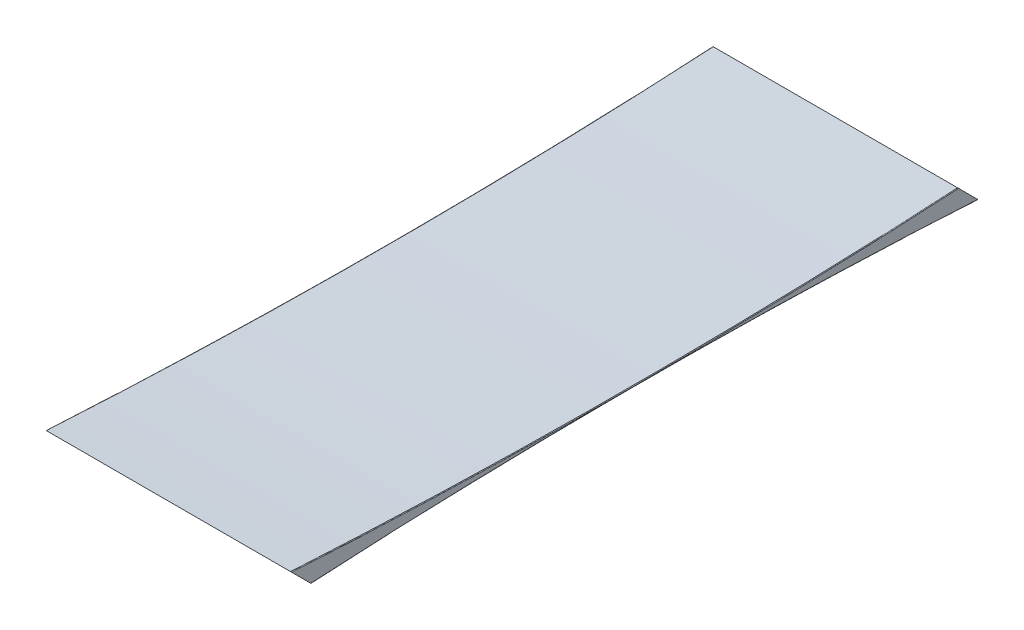
ISO-10303-21;
HEADER;
FILE_DESCRIPTION(('STEP AP214'),'2;1');
FILE_NAME('part.step','',(''),(''),'','','');
FILE_SCHEMA(('AUTOMOTIVE_DESIGN { 1 0 10303 214 1 1 1 1 }'));
ENDSEC;
DATA;
#1=APPLICATION_CONTEXT('core data for automotive mechanical design processes');
#2=APPLICATION_PROTOCOL_DEFINITION('international standard','automotive_design',2000,#1);
#3=PRODUCT_CONTEXT('',#1,'mechanical');
#4=PRODUCT('Part','Part','',(#3));
#5=PRODUCT_RELATED_PRODUCT_CATEGORY('part','',(#4));
#6=PRODUCT_DEFINITION_FORMATION('','',#4);
#7=PRODUCT_DEFINITION_CONTEXT('part definition',#1,'design');
#8=PRODUCT_DEFINITION('design','',#6,#7);
#9=PRODUCT_DEFINITION_SHAPE('','',#8);
#10=(LENGTH_UNIT() NAMED_UNIT(*) SI_UNIT(.MILLI.,.METRE.));
#11=(NAMED_UNIT(*) PLANE_ANGLE_UNIT() SI_UNIT($,.RADIAN.));
#12=(NAMED_UNIT(*) SI_UNIT($,.STERADIAN.) SOLID_ANGLE_UNIT());
#13=UNCERTAINTY_MEASURE_WITH_UNIT(LENGTH_MEASURE(1.E-05),#10,'distance_accuracy_value','');
#14=(GEOMETRIC_REPRESENTATION_CONTEXT(3) GLOBAL_UNCERTAINTY_ASSIGNED_CONTEXT((#13)) GLOBAL_UNIT_ASSIGNED_CONTEXT((#10,
#11,#12)) REPRESENTATION_CONTEXT('',''));
#15=CARTESIAN_POINT('',(0.,0.,0.));
#16=DIRECTION('',(0.,0.,1.));
#17=DIRECTION('',(1.,0.,0.));
#18=AXIS2_PLACEMENT_3D('',#15,#16,#17);
#19=CARTESIAN_POINT('',(-1.,0.087,-2.8));
#20=DIRECTION('',(1.,0.,0.));
#21=DIRECTION('',(0.,0.,-1.));
#22=AXIS2_PLACEMENT_3D('',#19,#20,#21);
#23=PLANE('',#22);
#24=DIRECTION('',(0.,0.707106781186552,0.707106781186543));
#25=VECTOR('',#24,1.);
#26=CARTESIAN_POINT('',(-1.,-0.087,-2.8));
#27=LINE('',#26,#25);
#28=CARTESIAN_POINT('',(-1.,-0.0816798720025339,-2.79467987200253));
#29=VERTEX_POINT('',#28);
#30=CARTESIAN_POINT('',(-1.,0.0728879448080079,-2.64011205519199));
#31=VERTEX_POINT('',#30);
#32=EDGE_CURVE('E222',#29,#31,#27,.T.);
#33=ORIENTED_EDGE('',*,*,#32,.F.);
#34=CARTESIAN_POINT('',(-1.,-47.8508780487805,0.));
#35=DIRECTION('',(1.,0.,0.));
#36=DIRECTION('',(0.,0.,-1.));
#37=AXIS2_PLACEMENT_3D('',#34,#35,#36);
#38=CIRCLE('',#37,47.8508780487805);
#39=CARTESIAN_POINT('',(-1.,0.,0.));
#40=VERTEX_POINT('',#39);
#41=EDGE_CURVE('E11',#29,#40,#38,.T.);
#42=ORIENTED_EDGE('',*,*,#41,.T.);
#43=CARTESIAN_POINT('',(-1.,47.8508780487805,0.));
#44=DIRECTION('',(1.,0.,0.));
#45=DIRECTION('',(0.,0.,-1.));
#46=AXIS2_PLACEMENT_3D('',#43,#44,#45);
#47=CIRCLE('',#46,47.8508780487805);
#48=EDGE_CURVE('E224',#40,#31,#47,.T.);
#49=ORIENTED_EDGE('',*,*,#48,.T.);
#50=EDGE_LOOP('',(#33,#42,#49));
#51=FACE_BOUND('',#50,.T.);
#52=ADVANCED_FACE('F39',(#51),#23,.F.);
#53=CARTESIAN_POINT('',(1.,0.087,-2.8));
#54=DIRECTION('',(-1.,0.,0.));
#55=DIRECTION('',(0.,0.,1.));
#56=AXIS2_PLACEMENT_3D('',#53,#54,#55);
#57=PLANE('',#56);
#58=DIRECTION('',(0.,-0.707106781186546,-0.707106781186549));
#59=VECTOR('',#58,1.);
#60=CARTESIAN_POINT('',(1.,0.087,2.8));
#61=LINE('',#60,#59);
#62=CARTESIAN_POINT('',(1.,0.0816798720025357,2.79467987200254));
#63=VERTEX_POINT('',#62);
#64=CARTESIAN_POINT('',(1.,-0.0728879448080067,2.64011205519199));
#65=VERTEX_POINT('',#64);
#66=EDGE_CURVE('E113',#63,#65,#61,.T.);
#67=ORIENTED_EDGE('',*,*,#66,.T.);
#68=CARTESIAN_POINT('',(1.,-47.8508780487805,0.));
#69=DIRECTION('',(-1.,0.,0.));
#70=DIRECTION('',(0.,0.,1.));
#71=AXIS2_PLACEMENT_3D('',#68,#69,#70);
#72=CIRCLE('',#71,47.8508780487805);
#73=CARTESIAN_POINT('',(1.,0.,0.));
#74=VERTEX_POINT('',#73);
#75=EDGE_CURVE('E115',#65,#74,#72,.T.);
#76=ORIENTED_EDGE('',*,*,#75,.T.);
#77=CARTESIAN_POINT('',(1.,47.8508780487805,0.));
#78=DIRECTION('',(-1.,0.,0.));
#79=DIRECTION('',(0.,0.,1.));
#80=AXIS2_PLACEMENT_3D('',#77,#78,#79);
#81=CIRCLE('',#80,47.8508780487805);
#82=EDGE_CURVE('E110',#74,#63,#81,.T.);
#83=ORIENTED_EDGE('',*,*,#82,.T.);
#84=EDGE_LOOP('',(#67,#76,#83));
#85=FACE_BOUND('',#84,.T.);
#86=ADVANCED_FACE('F112',(#85),#57,.F.);
#87=CARTESIAN_POINT('',(1.,47.8508780487805,0.));
#88=DIRECTION('',(-1.,0.,0.));
#89=DIRECTION('',(0.,0.,1.));
#90=AXIS2_PLACEMENT_3D('',#87,#88,#89);
#91=CIRCLE('',#90,47.8508780487805);
#92=CARTESIAN_POINT('',(1.,0.0728879448080079,-2.64011205519199));
#93=VERTEX_POINT('',#92);
#94=EDGE_CURVE('E121',#93,#74,#91,.T.);
#95=ORIENTED_EDGE('',*,*,#94,.T.);
#96=CARTESIAN_POINT('',(1.,-47.8508780487805,0.));
#97=DIRECTION('',(-1.,0.,0.));
#98=DIRECTION('',(0.,0.,1.));
#99=AXIS2_PLACEMENT_3D('',#96,#97,#98);
#100=CIRCLE('',#99,47.8508780487805);
#101=CARTESIAN_POINT('',(1.,-0.0816798720025339,-2.79467987200253));
#102=VERTEX_POINT('',#101);
#103=EDGE_CURVE('E254',#74,#102,#100,.T.);
#104=ORIENTED_EDGE('',*,*,#103,.T.);
#105=DIRECTION('',(0.,0.707106781186552,0.707106781186543));
#106=VECTOR('',#105,1.);
#107=CARTESIAN_POINT('',(1.,-0.087,-2.8));
#108=LINE('',#107,#106);
#109=EDGE_CURVE('E226',#102,#93,#108,.T.);
#110=ORIENTED_EDGE('',*,*,#109,.T.);
#111=EDGE_LOOP('',(#95,#104,#110));
#112=FACE_BOUND('',#111,.T.);
#113=ADVANCED_FACE('F199',(#112),#57,.F.);
#114=CARTESIAN_POINT('',(-1.,47.8508780487805,0.));
#115=DIRECTION('',(1.,0.,0.));
#116=DIRECTION('',(0.,0.,-1.));
#117=AXIS2_PLACEMENT_3D('',#114,#115,#116);
#118=CIRCLE('',#117,47.8508780487805);
#119=CARTESIAN_POINT('',(-1.,0.0816798720025357,2.79467987200254));
#120=VERTEX_POINT('',#119);
#121=EDGE_CURVE('E233',#120,#40,#118,.T.);
#122=ORIENTED_EDGE('',*,*,#121,.T.);
#123=CARTESIAN_POINT('',(-1.,-47.8508780487805,0.));
#124=DIRECTION('',(1.,0.,0.));
#125=DIRECTION('',(0.,0.,-1.));
#126=AXIS2_PLACEMENT_3D('',#123,#124,#125);
#127=CIRCLE('',#126,47.8508780487805);
#128=CARTESIAN_POINT('',(-1.,-0.0728879448080067,2.64011205519199));
#129=VERTEX_POINT('',#128);
#130=EDGE_CURVE('E48',#40,#129,#127,.T.);
#131=ORIENTED_EDGE('',*,*,#130,.T.);
#132=DIRECTION('',(0.,-0.707106781186546,-0.707106781186549));
#133=VECTOR('',#132,1.);
#134=CARTESIAN_POINT('',(-1.,0.087,2.8));
#135=LINE('',#134,#133);
#136=EDGE_CURVE('E133',#120,#129,#135,.T.);
#137=ORIENTED_EDGE('',*,*,#136,.F.);
#138=EDGE_LOOP('',(#122,#131,#137));
#139=FACE_BOUND('',#138,.T.);
#140=ADVANCED_FACE('F203',(#139),#23,.F.);
#141=CARTESIAN_POINT('',(1.,-47.8508780487805,0.));
#142=DIRECTION('',(-1.,0.,0.));
#143=DIRECTION('',(0.,0.,1.));
#144=AXIS2_PLACEMENT_3D('',#141,#142,#143);
#145=CYLINDRICAL_SURFACE('',#144,47.8458780487805);
#146=DIRECTION('',(-1.,0.,0.));
#147=VECTOR('',#146,1.);
#148=CARTESIAN_POINT('',(-1.,-0.087,-2.8));
#149=LINE('',#148,#147);
#150=CARTESIAN_POINT('',(0.995,-0.087,-2.8));
#151=VERTEX_POINT('',#150);
#152=CARTESIAN_POINT('',(-0.995000000000001,-0.087,-2.8));
#153=VERTEX_POINT('',#152);
#154=EDGE_CURVE('E245',#151,#153,#149,.T.);
#155=ORIENTED_EDGE('',*,*,#154,.F.);
#156=CARTESIAN_POINT('',(0.995,-47.8508780487805,0.));
#157=DIRECTION('',(-1.,0.,0.));
#158=DIRECTION('',(0.,0.,1.));
#159=AXIS2_PLACEMENT_3D('',#156,#157,#158);
#160=CIRCLE('',#159,47.8458780487805);
#161=CARTESIAN_POINT('',(0.995,-0.0776335500721238,2.63536644992788));
#162=VERTEX_POINT('',#161);
#163=EDGE_CURVE('E178',#151,#162,#160,.F.);
#164=ORIENTED_EDGE('',*,*,#163,.T.);
#165=DIRECTION('',(-1.,0.,0.));
#166=VECTOR('',#165,1.);
#167=CARTESIAN_POINT('',(1.,-0.0776335500721238,2.63536644992788));
#168=LINE('',#167,#166);
#169=CARTESIAN_POINT('',(-0.995000000000001,-0.0776335500721238,2.63536644992788));
#170=VERTEX_POINT('',#169);
#171=EDGE_CURVE('E132',#162,#170,#168,.T.);
#172=ORIENTED_EDGE('',*,*,#171,.T.);
#173=CARTESIAN_POINT('',(-0.995000000000001,-47.8508780487805,0.));
#174=DIRECTION('',(1.,0.,0.));
#175=DIRECTION('',(0.,0.,-1.));
#176=AXIS2_PLACEMENT_3D('',#173,#174,#175);
#177=CIRCLE('',#176,47.8458780487805);
#178=EDGE_CURVE('E180',#170,#153,#177,.F.);
#179=ORIENTED_EDGE('',*,*,#178,.T.);
#180=EDGE_LOOP('',(#155,#164,#172,#179));
#181=FACE_BOUND('',#180,.T.);
#182=ADVANCED_FACE('F207',(#181),#145,.F.);
#183=CARTESIAN_POINT('',(1.,47.8508780487805,0.));
#184=DIRECTION('',(-1.,0.,0.));
#185=DIRECTION('',(0.,0.,1.));
#186=AXIS2_PLACEMENT_3D('',#183,#184,#185);
#187=CYLINDRICAL_SURFACE('',#186,47.8458780487805);
#188=DIRECTION('',(1.,0.,0.));
#189=VECTOR('',#188,1.);
#190=CARTESIAN_POINT('',(-1.,0.087,2.8));
#191=LINE('',#190,#189);
#192=CARTESIAN_POINT('',(-0.995000000000001,0.087,2.8));
#193=VERTEX_POINT('',#192);
#194=CARTESIAN_POINT('',(0.995,0.087,2.8));
#195=VERTEX_POINT('',#194);
#196=EDGE_CURVE('E243',#193,#195,#191,.T.);
#197=ORIENTED_EDGE('',*,*,#196,.T.);
#198=CARTESIAN_POINT('',(0.995,47.8508780487805,0.));
#199=DIRECTION('',(-1.,0.,0.));
#200=DIRECTION('',(0.,0.,1.));
#201=AXIS2_PLACEMENT_3D('',#198,#199,#200);
#202=CIRCLE('',#201,47.8458780487805);
#203=CARTESIAN_POINT('',(0.995,0.0776335500721238,-2.63536644992787));
#204=VERTEX_POINT('',#203);
#205=EDGE_CURVE('E138',#195,#204,#202,.F.);
#206=ORIENTED_EDGE('',*,*,#205,.T.);
#207=DIRECTION('',(-1.,0.,0.));
#208=VECTOR('',#207,1.);
#209=CARTESIAN_POINT('',(1.,0.0776335500721238,-2.63536644992787));
#210=LINE('',#209,#208);
#211=CARTESIAN_POINT('',(-0.995000000000001,0.0776335500721238,-2.63536644992787));
#212=VERTEX_POINT('',#211);
#213=EDGE_CURVE('E122',#204,#212,#210,.T.);
#214=ORIENTED_EDGE('',*,*,#213,.T.);
#215=CARTESIAN_POINT('',(-0.995000000000001,47.8508780487805,0.));
#216=DIRECTION('',(1.,0.,0.));
#217=DIRECTION('',(0.,0.,-1.));
#218=AXIS2_PLACEMENT_3D('',#215,#216,#217);
#219=CIRCLE('',#218,47.8458780487805);
#220=EDGE_CURVE('E141',#212,#193,#219,.F.);
#221=ORIENTED_EDGE('',*,*,#220,.T.);
#222=EDGE_LOOP('',(#197,#206,#214,#221));
#223=FACE_BOUND('',#222,.T.);
#224=ADVANCED_FACE('F209',(#223),#187,.F.);
#225=CARTESIAN_POINT('',(1.,-0.087,-2.8));
#226=DIRECTION('',(0.,-0.707106781186543,0.707106781186552));
#227=DIRECTION('',(0.,-0.707106781186552,-0.707106781186543));
#228=AXIS2_PLACEMENT_3D('',#225,#226,#227);
#229=PLANE('',#228);
#230=ORIENTED_EDGE('',*,*,#109,.F.);
#231=CARTESIAN_POINT('',(1.,-0.0816798720025338,-2.79467987200253));
#232=CARTESIAN_POINT('',(0.999998683792411,-0.0821121717058165,-2.79511217170582));
#233=CARTESIAN_POINT('',(0.999950170348066,-0.0825466146464124,-2.79554661464641));
#234=CARTESIAN_POINT('',(0.999747872332375,-0.0834080218772378,-2.79640802187724));
#235=CARTESIAN_POINT('',(0.999592864285455,-0.0838348394598447,-2.79683483945984));
#236=CARTESIAN_POINT('',(0.999247995260036,-0.0845005570585022,-2.7975005570585));
#237=CARTESIAN_POINT('',(0.999094250409052,-0.0847487933637279,-2.79774879336373));
#238=CARTESIAN_POINT('',(0.998737801105745,-0.0852265069057193,-2.79822650690572));
#239=CARTESIAN_POINT('',(0.99853527013512,-0.0854560468398723,-2.79845604683987));
#240=CARTESIAN_POINT('',(0.99813680900477,-0.0858296573216617,-2.79882965732166));
#241=CARTESIAN_POINT('',(0.997953248429835,-0.0859802949824659,-2.79898029498247));
#242=CARTESIAN_POINT('',(0.997555179474348,-0.0862598056698357,-2.79925980566984));
#243=CARTESIAN_POINT('',(0.997340704734536,-0.0863887020285581,-2.79938870202856));
#244=CARTESIAN_POINT('',(0.996934743564047,-0.0865899125991077,-2.79958991259911));
#245=CARTESIAN_POINT('',(0.996749422341879,-0.086668418022439,-2.79966841802244));
#246=CARTESIAN_POINT('',(0.996363333865869,-0.0868029374896735,-2.79980293748967));
#247=CARTESIAN_POINT('',(0.996162606867747,-0.086859007922175,-2.79985900792218));
#248=CARTESIAN_POINT('',(0.995801626057288,-0.0869338490835032,-2.7999338490835));
#249=CARTESIAN_POINT('',(0.99564377031734,-0.0869584358189863,-2.79995843581899));
#250=CARTESIAN_POINT('',(0.995324024054903,-0.0869916141569341,-2.79999161415693));
#251=CARTESIAN_POINT('',(0.995162118456007,-0.0870001325589239,-2.80000013255892));
#252=CARTESIAN_POINT('',(0.99500000000017,-0.0870000000004094,-2.80000000000041));
#253=B_SPLINE_CURVE_WITH_KNOTS('',3,(#231,#232,#233,#234,#235,#236,#237,#238,#239,#240,#241,
#242,#243,#244,#245,#246,#247,#248,#249,#250,#251,#252),.UNSPECIFIED.,.F.,.F.,(4,2,2,2,2,2,2,2,
2,2,4),(0.,0.00183749282639248,0.00369645687012474,0.0048430809514714,0.00598568635516742,
0.00682668264974607,0.00766677058769647,0.00831245724891956,0.00895651067610101,
0.00943986385642203,0.00992541371919267),.UNSPECIFIED.);
#254=EDGE_CURVE('E183',#102,#151,#253,.T.);
#255=ORIENTED_EDGE('',*,*,#254,.T.);
#256=ORIENTED_EDGE('',*,*,#154,.T.);
#257=CARTESIAN_POINT('',(-0.995000000000001,-0.087,-2.8));
#258=CARTESIAN_POINT('',(-0.995216901893383,-0.0870004101722005,-2.8000004101722));
#259=CARTESIAN_POINT('',(-0.995433140295378,-0.0869850101276896,-2.79998501012769));
#260=CARTESIAN_POINT('',(-0.995855753114274,-0.0869262348870719,-2.79992623488707));
#261=CARTESIAN_POINT('',(-0.99606220405846,-0.0868831384957062,-2.79988313849571));
#262=CARTESIAN_POINT('',(-0.996460575861353,-0.0867726781872132,-2.79977267818721));
#263=CARTESIAN_POINT('',(-0.996652543931191,-0.0867053976436001,-2.7997053976436));
#264=CARTESIAN_POINT('',(-0.997020137676347,-0.08655096344999,-2.79955096344999));
#265=CARTESIAN_POINT('',(-0.997195719004697,-0.0864637579556234,-2.79946375795562));
#266=CARTESIAN_POINT('',(-0.997606390059985,-0.0862295140165084,-2.79922951401651));
#267=CARTESIAN_POINT('',(-0.997831224624072,-0.0860735013741543,-2.79907350137415));
#268=CARTESIAN_POINT('',(-0.998243133097384,-0.085738415200935,-2.79873841520094));
#269=CARTESIAN_POINT('',(-0.998430132746487,-0.0855592974271281,-2.79855929742713));
#270=CARTESIAN_POINT('',(-0.998847966936125,-0.0850981666668505,-2.79809816666685));
#271=CARTESIAN_POINT('',(-0.99905868611793,-0.0848070687889248,-2.79780706878892));
#272=CARTESIAN_POINT('',(-0.999413527209268,-0.0842050307371218,-2.79720503073712));
#273=CARTESIAN_POINT('',(-0.999557463486291,-0.0838940379570791,-2.79689403795708));
#274=CARTESIAN_POINT('',(-0.999782664783342,-0.0832666673563759,-2.79626666735638));
#275=CARTESIAN_POINT('',(-0.999864940884833,-0.0829504674585192,-2.79595046745852));
#276=CARTESIAN_POINT('',(-0.999973171211622,-0.0823160001205753,-2.79531600012058));
#277=CARTESIAN_POINT('',(-0.999999605018077,-0.0819977740251477,-2.79499777402515));
#278=CARTESIAN_POINT('',(-1.00000000000021,-0.0816798720025721,-2.79467987200257));
#279=B_SPLINE_CURVE_WITH_KNOTS('',3,(#257,#258,#259,#260,#261,#262,#263,#264,#265,#266,#267,
#268,#269,#270,#271,#272,#273,#274,#275,#276,#277,#278),.UNSPECIFIED.,.F.,.F.,(4,2,2,2,2,2,2,2,
2,2,4),(0.,0.000648562964042904,0.0012906973256875,0.00193063886871312,0.00257226488327262,
0.00351200879358195,0.00445357965675983,0.0058334481424035,0.00721712952191226,
0.0085775930704448,0.00992632446580622),.UNSPECIFIED.);
#280=EDGE_CURVE('E231',#153,#29,#279,.T.);
#281=ORIENTED_EDGE('',*,*,#280,.T.);
#282=ORIENTED_EDGE('',*,*,#32,.T.);
#283=CARTESIAN_POINT('',(-1.,0.0728879448080102,-2.640112055192));
#284=CARTESIAN_POINT('',(-0.999999733058547,0.0731853477140063,-2.639814652286));
#285=CARTESIAN_POINT('',(-0.999970500026461,0.0734831348981257,-2.63951686510188));
#286=CARTESIAN_POINT('',(-0.999851654941646,0.0740747401933507,-2.63892525980665));
#287=CARTESIAN_POINT('',(-0.999761612835676,0.0743685147242253,-2.63863148527578));
#288=CARTESIAN_POINT('',(-0.99952762789137,0.0749216733735903,-2.63807832662641));
#289=CARTESIAN_POINT('',(-0.999388162762115,0.0751819942151301,-2.63781800578487));
#290=CARTESIAN_POINT('',(-0.999052506486514,0.0756833429174989,-2.6373166570825));
#291=CARTESIAN_POINT('',(-0.998856462248008,0.0759244187046625,-2.63707558129534));
#292=CARTESIAN_POINT('',(-0.998460898871596,0.0763209415694909,-2.63667905843051));
#293=CARTESIAN_POINT('',(-0.998274269560641,0.076482807353918,-2.63651719264608));
#294=CARTESIAN_POINT('',(-0.997866893920721,0.0767836266447907,-2.63621637335521));
#295=CARTESIAN_POINT('',(-0.997646182786725,0.0769226034852074,-2.63607739651479));
#296=CARTESIAN_POINT('',(-0.997217573066351,0.0771463291589208,-2.63585367084108));
#297=CARTESIAN_POINT('',(-0.997015210840402,0.0772363643106262,-2.63576363568938));
#298=CARTESIAN_POINT('',(-0.99659242689804,0.0773915464479309,-2.63560845355207));
#299=CARTESIAN_POINT('',(-0.996372043878006,0.0774567451448126,-2.63554325485519));
#300=CARTESIAN_POINT('',(-0.995960657051716,0.077548595505437,-2.63545140449457));
#301=CARTESIAN_POINT('',(-0.995771847595812,0.0775801706274319,-2.63541982937257));
#302=CARTESIAN_POINT('',(-0.995388793614696,0.0776227828702938,-2.63537721712971));
#303=CARTESIAN_POINT('',(-0.995194528126399,0.0776337250904129,-2.63536627490959));
#304=CARTESIAN_POINT('',(-0.995000000000521,0.0776335500732904,-2.63536644992671));
#305=B_SPLINE_CURVE_WITH_KNOTS('',3,(#283,#284,#285,#286,#287,#288,#289,#290,#291,#292,#293,
#294,#295,#296,#297,#298,#299,#300,#301,#302,#303,#304),.UNSPECIFIED.,.F.,.F.,(4,2,2,2,2,2,2,2,
2,2,4),(0.,0.001261686936575,0.00253239151983525,0.00370913987332889,0.00488285986963996,
0.00576584075079779,0.00664791583567737,0.00736235851857031,0.00807530544261987,
0.00865517775106186,0.00923771072943985),.UNSPECIFIED.);
#306=EDGE_CURVE('E237',#31,#212,#305,.T.);
#307=ORIENTED_EDGE('',*,*,#306,.T.);
#308=ORIENTED_EDGE('',*,*,#213,.F.);
#309=CARTESIAN_POINT('',(0.995,0.0776335500721169,-2.63536644992787));
#310=CARTESIAN_POINT('',(0.995231390024723,0.077633902503595,-2.6353660974964));
#311=CARTESIAN_POINT('',(0.995462283299717,0.077618329283271,-2.63538167071673));
#312=CARTESIAN_POINT('',(0.995914714372969,0.077558354881895,-2.63544164511811));
#313=CARTESIAN_POINT('',(0.996136310025915,0.0775141741379011,-2.6354858258621));
#314=CARTESIAN_POINT('',(0.996565026090545,0.0774000555090798,-2.63559994449092));
#315=CARTESIAN_POINT('',(0.996772177924585,0.0773301757531332,-2.63566982424687));
#316=CARTESIAN_POINT('',(0.997169034294186,0.0771686616823024,-2.6358313383177));
#317=CARTESIAN_POINT('',(0.997358703567557,0.0770769846797331,-2.63592301532027));
#318=CARTESIAN_POINT('',(0.997782413187157,0.0768399956551473,-2.63616000434485));
#319=CARTESIAN_POINT('',(0.998008106739274,0.0766872219068775,-2.63631277809312));
#320=CARTESIAN_POINT('',(0.998421496928208,0.0763579093933628,-2.63664209060664));
#321=CARTESIAN_POINT('',(0.998609131562479,0.0761813326167167,-2.63681866738329));
#322=CARTESIAN_POINT('',(0.999001205742222,0.0757520293960761,-2.63724797060393));
#323=CARTESIAN_POINT('',(0.999191831804915,0.0754930084130108,-2.63750699158699));
#324=CARTESIAN_POINT('',(0.999511682114065,0.0749565497915819,-2.63804345020842));
#325=CARTESIAN_POINT('',(0.99964079426304,0.0746790795731638,-2.63832092042684));
#326=CARTESIAN_POINT('',(0.999827924622525,0.0741494264203025,-2.6388505735797));
#327=CARTESIAN_POINT('',(0.999892822710276,0.0738984300166614,-2.63910156998334));
#328=CARTESIAN_POINT('',(0.999978651711754,0.0733942194740792,-2.63960578052592));
#329=CARTESIAN_POINT('',(0.9999998456152,0.0731410278621633,-2.63985897213784));
#330=CARTESIAN_POINT('',(1.00000000000015,0.0728879448080341,-2.64011205519197));
#331=B_SPLINE_CURVE_WITH_KNOTS('',3,(#309,#310,#311,#312,#313,#314,#315,#316,#317,#318,#319,
#320,#321,#322,#323,#324,#325,#326,#327,#328,#329,#330),.UNSPECIFIED.,.F.,.F.,(4,2,2,2,2,2,2,2,
2,2,4),(0.,0.000692336828693087,0.00137940129629631,0.00206492114872294,0.00275179474346796,
0.00368398860277266,0.00461768913153838,0.00584996823996211,0.00708448443548483,
0.00816435146879968,0.00923770121723926),.UNSPECIFIED.);
#332=EDGE_CURVE('E189',#204,#93,#331,.T.);
#333=ORIENTED_EDGE('',*,*,#332,.T.);
#334=EDGE_LOOP('',(#230,#255,#256,#281,#282,#307,#308,#333));
#335=FACE_BOUND('',#334,.T.);
#336=ADVANCED_FACE('F167',(#335),#229,.F.);
#337=CARTESIAN_POINT('',(1.,0.087,2.8));
#338=DIRECTION('',(0.,0.707106781186549,-0.707106781186546));
#339=DIRECTION('',(0.,0.707106781186546,0.707106781186549));
#340=AXIS2_PLACEMENT_3D('',#337,#338,#339);
#341=PLANE('',#340);
#342=ORIENTED_EDGE('',*,*,#171,.F.);
#343=CARTESIAN_POINT('',(0.995,-0.0776335500721169,2.63536644992788));
#344=CARTESIAN_POINT('',(0.995231390024724,-0.0776339025035952,2.6353660974964));
#345=CARTESIAN_POINT('',(0.995462283299718,-0.0776183292832712,2.63538167071673));
#346=CARTESIAN_POINT('',(0.99591471437297,-0.0775583548818948,2.63544164511811));
#347=CARTESIAN_POINT('',(0.996136310025916,-0.0775141741379008,2.6354858258621));
#348=CARTESIAN_POINT('',(0.996565026090545,-0.077400055509079,2.63559994449092));
#349=CARTESIAN_POINT('',(0.996772177924585,-0.077330175753132,2.63566982424687));
#350=CARTESIAN_POINT('',(0.997169034294185,-0.0771686616823008,2.6358313383177));
#351=CARTESIAN_POINT('',(0.997358703567556,-0.0770769846797313,2.63592301532027));
#352=CARTESIAN_POINT('',(0.997782413187157,-0.0768399956551455,2.63616000434485));
#353=CARTESIAN_POINT('',(0.998008106739273,-0.0766872219068757,2.63631277809312));
#354=CARTESIAN_POINT('',(0.998421496928212,-0.0763579093933633,2.63664209060664));
#355=CARTESIAN_POINT('',(0.998609131562487,-0.0761813326167193,2.63681866738328));
#356=CARTESIAN_POINT('',(0.999001205742231,-0.0757520293960795,2.63724797060392));
#357=CARTESIAN_POINT('',(0.999191831804919,-0.0754930084130116,2.63750699158699));
#358=CARTESIAN_POINT('',(0.999511682114064,-0.0749565497915795,2.63804345020842));
#359=CARTESIAN_POINT('',(0.999640794263039,-0.0746790795731611,2.63832092042684));
#360=CARTESIAN_POINT('',(0.999827924622526,-0.0741494264202992,2.6388505735797));
#361=CARTESIAN_POINT('',(0.999892822710278,-0.073898430016658,2.63910156998334));
#362=CARTESIAN_POINT('',(0.999978651711757,-0.0733942194740764,2.63960578052592));
#363=CARTESIAN_POINT('',(0.999999845615202,-0.0731410278621613,2.63985897213784));
#364=CARTESIAN_POINT('',(1.00000000000015,-0.0728879448080329,2.64011205519197));
#365=B_SPLINE_CURVE_WITH_KNOTS('',3,(#343,#344,#345,#346,#347,#348,#349,#350,#351,#352,#353,
#354,#355,#356,#357,#358,#359,#360,#361,#362,#363,#364),.UNSPECIFIED.,.F.,.F.,(4,2,2,2,2,2,2,2,
2,2,4),(0.,0.000692336828694219,0.00137940129629595,0.00206492114872238,0.00275179474346773,
0.00368398860277326,0.00461768913153848,0.00584996823996364,0.00708448443548973,
0.00816435146880505,0.00923770121724134),.UNSPECIFIED.);
#366=EDGE_CURVE('E131',#162,#65,#365,.T.);
#367=ORIENTED_EDGE('',*,*,#366,.T.);
#368=ORIENTED_EDGE('',*,*,#66,.F.);
#369=CARTESIAN_POINT('',(1.,0.0816798720025373,2.79467987200253));
#370=CARTESIAN_POINT('',(0.999998683792411,0.0821121717058192,2.79511217170582));
#371=CARTESIAN_POINT('',(0.999950170348067,0.0825466146464153,2.79554661464642));
#372=CARTESIAN_POINT('',(0.999747872332375,0.0834080218772405,2.79640802187724));
#373=CARTESIAN_POINT('',(0.999592864285455,0.0838348394598471,2.79683483945985));
#374=CARTESIAN_POINT('',(0.999247995260036,0.0845005570585035,2.7975005570585));
#375=CARTESIAN_POINT('',(0.999094250409052,0.0847487933637286,2.79774879336373));
#376=CARTESIAN_POINT('',(0.998737801105745,0.0852265069057194,2.79822650690572));
#377=CARTESIAN_POINT('',(0.99853527013512,0.0854560468398722,2.79845604683987));
#378=CARTESIAN_POINT('',(0.99813680900477,0.0858296573216622,2.79882965732166));
#379=CARTESIAN_POINT('',(0.997953248429835,0.0859802949824668,2.79898029498247));
#380=CARTESIAN_POINT('',(0.997555179474348,0.086259805669837,2.79925980566984));
#381=CARTESIAN_POINT('',(0.997340704734537,0.0863887020285592,2.79938870202856));
#382=CARTESIAN_POINT('',(0.996934743564046,0.0865899125991078,2.79958991259911));
#383=CARTESIAN_POINT('',(0.996749422341877,0.0866684180224384,2.79966841802244));
#384=CARTESIAN_POINT('',(0.996363333865865,0.0868029374896702,2.79980293748967));
#385=CARTESIAN_POINT('',(0.996162606867742,0.0868590079221699,2.79985900792217));
#386=CARTESIAN_POINT('',(0.995801626057282,0.0869338490834971,2.7999338490835));
#387=CARTESIAN_POINT('',(0.995643770317335,0.0869584358189805,2.79995843581898));
#388=CARTESIAN_POINT('',(0.9953240240549,0.0869916141569303,2.79999161415693));
#389=CARTESIAN_POINT('',(0.995162118456005,0.0870001325589218,2.80000013255892));
#390=CARTESIAN_POINT('',(0.995000000000169,0.0870000000004095,2.80000000000041));
#391=B_SPLINE_CURVE_WITH_KNOTS('',3,(#369,#370,#371,#372,#373,#374,#375,#376,#377,#378,#379,
#380,#381,#382,#383,#384,#385,#386,#387,#388,#389,#390),.UNSPECIFIED.,.F.,.F.,(4,2,2,2,2,2,2,2,
2,2,4),(0.,0.00183749282639481,0.00369645687012487,0.00484308095146969,0.00598568635516536,
0.00682668264974519,0.00766677058769518,0.00831245724891865,0.00895651067610159,
0.00943986385642125,0.00992541371918825),.UNSPECIFIED.);
#392=EDGE_CURVE('E128',#63,#195,#391,.T.);
#393=ORIENTED_EDGE('',*,*,#392,.T.);
#394=ORIENTED_EDGE('',*,*,#196,.F.);
#395=CARTESIAN_POINT('',(-0.995000000000001,0.087,2.8));
#396=CARTESIAN_POINT('',(-0.995216901893383,0.0870004101722005,2.8000004101722));
#397=CARTESIAN_POINT('',(-0.995433140295378,0.0869850101276896,2.79998501012769));
#398=CARTESIAN_POINT('',(-0.995855753114274,0.0869262348870719,2.79992623488707));
#399=CARTESIAN_POINT('',(-0.99606220405846,0.0868831384957061,2.79988313849571));
#400=CARTESIAN_POINT('',(-0.996460575861353,0.0867726781872132,2.79977267818721));
#401=CARTESIAN_POINT('',(-0.996652543931191,0.0867053976436001,2.7997053976436));
#402=CARTESIAN_POINT('',(-0.997020137676347,0.08655096344999,2.79955096344999));
#403=CARTESIAN_POINT('',(-0.997195719004697,0.0864637579556234,2.79946375795562));
#404=CARTESIAN_POINT('',(-0.997606390059985,0.0862295140165084,2.79922951401651));
#405=CARTESIAN_POINT('',(-0.997831224624072,0.0860735013741543,2.79907350137415));
#406=CARTESIAN_POINT('',(-0.998243133097384,0.0857384152009349,2.79873841520093));
#407=CARTESIAN_POINT('',(-0.998430132746487,0.085559297427128,2.79855929742713));
#408=CARTESIAN_POINT('',(-0.998847966936125,0.0850981666668505,2.79809816666685));
#409=CARTESIAN_POINT('',(-0.99905868611793,0.084807068788925,2.79780706878892));
#410=CARTESIAN_POINT('',(-0.999413527209268,0.084205030737122,2.79720503073712));
#411=CARTESIAN_POINT('',(-0.999557463486291,0.0838940379570792,2.79689403795708));
#412=CARTESIAN_POINT('',(-0.999782664783342,0.0832666673563762,2.79626666735638));
#413=CARTESIAN_POINT('',(-0.999864940884833,0.0829504674585198,2.79595046745852));
#414=CARTESIAN_POINT('',(-0.999973171211622,0.0823160001205765,2.79531600012058));
#415=CARTESIAN_POINT('',(-0.999999605018077,0.0819977740251492,2.79499777402515));
#416=CARTESIAN_POINT('',(-1.00000000000021,0.0816798720025738,2.79467987200257));
#417=B_SPLINE_CURVE_WITH_KNOTS('',3,(#395,#396,#397,#398,#399,#400,#401,#402,#403,#404,#405,
#406,#407,#408,#409,#410,#411,#412,#413,#414,#415,#416),.UNSPECIFIED.,.F.,.F.,(4,2,2,2,2,2,2,2,
2,2,4),(0.,0.000648562964042904,0.0012906973256875,0.00193063886871312,0.00257226488327262,
0.00351200879358237,0.0044535796567598,0.00583344814240325,0.0072171295219122,
0.00857759307044348,0.00992632446580373),.UNSPECIFIED.);
#418=EDGE_CURVE('E143',#193,#120,#417,.T.);
#419=ORIENTED_EDGE('',*,*,#418,.T.);
#420=ORIENTED_EDGE('',*,*,#136,.T.);
#421=CARTESIAN_POINT('',(-1.,-0.0728879448080102,2.640112055192));
#422=CARTESIAN_POINT('',(-0.999999733058547,-0.0731853477140057,2.639814652286));
#423=CARTESIAN_POINT('',(-0.999970500026461,-0.0734831348981247,2.63951686510188));
#424=CARTESIAN_POINT('',(-0.999851654941646,-0.0740747401933494,2.63892525980665));
#425=CARTESIAN_POINT('',(-0.999761612835676,-0.074368514724224,2.63863148527578));
#426=CARTESIAN_POINT('',(-0.99952762789137,-0.0749216733735893,2.63807832662641));
#427=CARTESIAN_POINT('',(-0.999388162762115,-0.0751819942151292,2.63781800578487));
#428=CARTESIAN_POINT('',(-0.999052506486514,-0.0756833429174977,2.6373166570825));
#429=CARTESIAN_POINT('',(-0.998856462248007,-0.0759244187046609,2.63707558129534));
#430=CARTESIAN_POINT('',(-0.998460898871597,-0.0763209415694907,2.63667905843051));
#431=CARTESIAN_POINT('',(-0.998274269560642,-0.0764828073539191,2.63651719264608));
#432=CARTESIAN_POINT('',(-0.997866893920719,-0.0767836266447901,2.63621637335521));
#433=CARTESIAN_POINT('',(-0.997646182786719,-0.0769226034852038,2.6360773965148));
#434=CARTESIAN_POINT('',(-0.99721757306635,-0.0771463291589242,2.63585367084108));
#435=CARTESIAN_POINT('',(-0.997015210840408,-0.0772363643106371,2.63576363568936));
#436=CARTESIAN_POINT('',(-0.996592426898047,-0.0773915464479412,2.63560845355206));
#437=CARTESIAN_POINT('',(-0.996372043878007,-0.0774567451448146,2.63554325485518));
#438=CARTESIAN_POINT('',(-0.995960657051714,-0.0775485955054336,2.63545140449457));
#439=CARTESIAN_POINT('',(-0.995771847595811,-0.0775801706274295,2.63541982937257));
#440=CARTESIAN_POINT('',(-0.995388793614697,-0.0776227828702936,2.63537721712971));
#441=CARTESIAN_POINT('',(-0.995194528126402,-0.0776337250904138,2.63536627490959));
#442=CARTESIAN_POINT('',(-0.995000000000523,-0.0776335500732887,2.63536644992671));
#443=B_SPLINE_CURVE_WITH_KNOTS('',3,(#421,#422,#423,#424,#425,#426,#427,#428,#429,#430,#431,
#432,#433,#434,#435,#436,#437,#438,#439,#440,#441,#442),.UNSPECIFIED.,.F.,.F.,(4,2,2,2,2,2,2,2,
2,2,4),(0.,0.00126168693657476,0.00253239151983541,0.00370913987332907,0.0048828598696401,
0.00576584075080005,0.00664791583568156,0.00736235851857452,0.00807530544262398,
0.00865517775106499,0.00923771072944165),.UNSPECIFIED.);
#444=EDGE_CURVE('E139',#129,#170,#443,.T.);
#445=ORIENTED_EDGE('',*,*,#444,.T.);
#446=EDGE_LOOP('',(#342,#367,#368,#393,#394,#419,#420,#445));
#447=FACE_BOUND('',#446,.T.);
#448=ADVANCED_FACE('F126',(#447),#341,.F.);
#449=CARTESIAN_POINT('',(0.995,-47.8508780487805,0.));
#450=DIRECTION('',(-1.,0.,0.));
#451=DIRECTION('',(0.,0.,1.));
#452=AXIS2_PLACEMENT_3D('',#449,#450,#451);
#453=TOROIDAL_SURFACE('',#452,47.8508780487805,0.005);
#454=ORIENTED_EDGE('',*,*,#366,.F.);
#455=ORIENTED_EDGE('',*,*,#163,.F.);
#456=ORIENTED_EDGE('',*,*,#254,.F.);
#457=ORIENTED_EDGE('',*,*,#103,.F.);
#458=ORIENTED_EDGE('',*,*,#75,.F.);
#459=EDGE_LOOP('',(#454,#455,#456,#457,#458));
#460=FACE_BOUND('',#459,.T.);
#461=ADVANCED_FACE('F166',(#460),#453,.T.);
#462=CARTESIAN_POINT('',(0.995,47.8508780487805,0.));
#463=DIRECTION('',(-1.,0.,0.));
#464=DIRECTION('',(0.,0.,1.));
#465=AXIS2_PLACEMENT_3D('',#462,#463,#464);
#466=TOROIDAL_SURFACE('',#465,47.8508780487805,0.005);
#467=ORIENTED_EDGE('',*,*,#332,.F.);
#468=ORIENTED_EDGE('',*,*,#205,.F.);
#469=ORIENTED_EDGE('',*,*,#392,.F.);
#470=ORIENTED_EDGE('',*,*,#82,.F.);
#471=ORIENTED_EDGE('',*,*,#94,.F.);
#472=EDGE_LOOP('',(#467,#468,#469,#470,#471));
#473=FACE_BOUND('',#472,.T.);
#474=ADVANCED_FACE('F137',(#473),#466,.T.);
#475=CARTESIAN_POINT('',(-0.995000000000001,-47.8508780487805,0.));
#476=DIRECTION('',(1.,0.,0.));
#477=DIRECTION('',(0.,0.,-1.));
#478=AXIS2_PLACEMENT_3D('',#475,#476,#477);
#479=TOROIDAL_SURFACE('',#478,47.8508780487805,0.005);
#480=ORIENTED_EDGE('',*,*,#130,.F.);
#481=ORIENTED_EDGE('',*,*,#41,.F.);
#482=ORIENTED_EDGE('',*,*,#280,.F.);
#483=ORIENTED_EDGE('',*,*,#178,.F.);
#484=ORIENTED_EDGE('',*,*,#444,.F.);
#485=EDGE_LOOP('',(#480,#481,#482,#483,#484));
#486=FACE_BOUND('',#485,.T.);
#487=ADVANCED_FACE('F229',(#486),#479,.T.);
#488=CARTESIAN_POINT('',(-0.995000000000001,47.8508780487805,0.));
#489=DIRECTION('',(1.,0.,0.));
#490=DIRECTION('',(0.,0.,-1.));
#491=AXIS2_PLACEMENT_3D('',#488,#489,#490);
#492=TOROIDAL_SURFACE('',#491,47.8508780487805,0.005);
#493=ORIENTED_EDGE('',*,*,#48,.F.);
#494=ORIENTED_EDGE('',*,*,#121,.F.);
#495=ORIENTED_EDGE('',*,*,#418,.F.);
#496=ORIENTED_EDGE('',*,*,#220,.F.);
#497=ORIENTED_EDGE('',*,*,#306,.F.);
#498=EDGE_LOOP('',(#493,#494,#495,#496,#497));
#499=FACE_BOUND('',#498,.T.);
#500=ADVANCED_FACE('F41',(#499),#492,.T.);
#501=CLOSED_SHELL('',(#52,#86,#113,#140,#182,#224,#336,#448,#461,#474,#487,#500));
#502=MANIFOLD_SOLID_BREP('B2',#501);
#503=ADVANCED_BREP_SHAPE_REPRESENTATION('',(#18,#502),#14);
#504=SHAPE_DEFINITION_REPRESENTATION(#9,#503);
ENDSEC;
END-ISO-10303-21;
